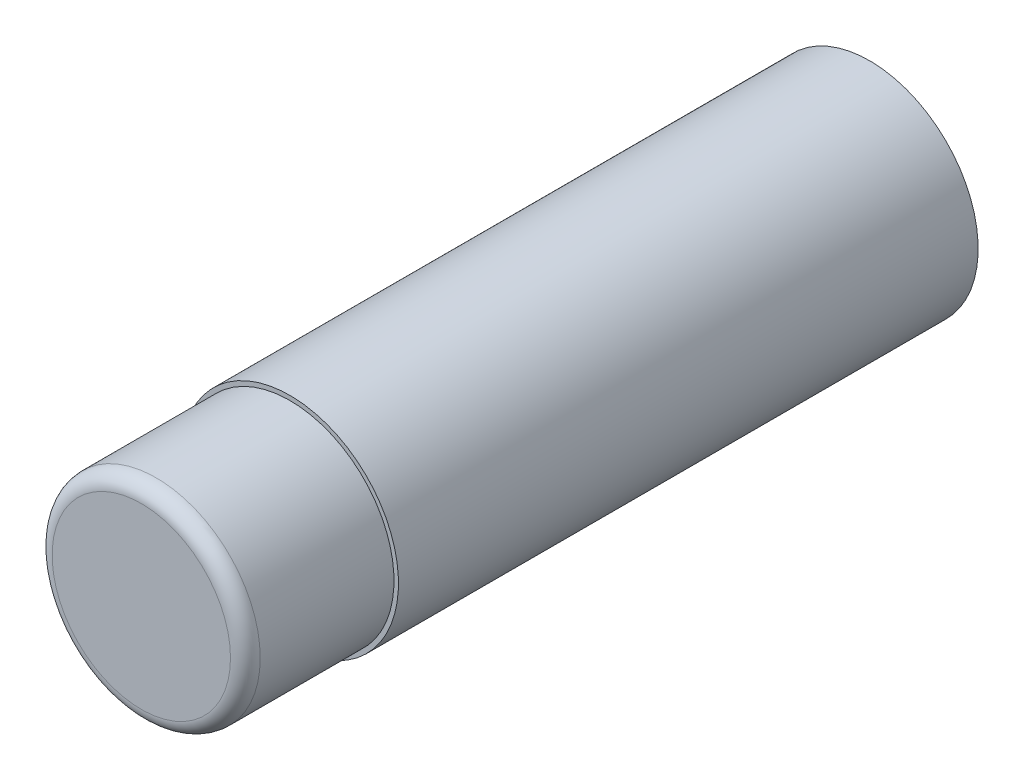
ISO-10303-21;
HEADER;
FILE_DESCRIPTION(('STEP AP214'),'2;1');
FILE_NAME('part.step','',(''),(''),'','','');
FILE_SCHEMA(('AUTOMOTIVE_DESIGN { 1 0 10303 214 1 1 1 1 }'));
ENDSEC;
DATA;
#1=APPLICATION_CONTEXT('core data for automotive mechanical design processes');
#2=APPLICATION_PROTOCOL_DEFINITION('international standard','automotive_design',2000,#1);
#3=PRODUCT_CONTEXT('',#1,'mechanical');
#4=PRODUCT('Part','Part','',(#3));
#5=PRODUCT_RELATED_PRODUCT_CATEGORY('part','',(#4));
#6=PRODUCT_DEFINITION_FORMATION('','',#4);
#7=PRODUCT_DEFINITION_CONTEXT('part definition',#1,'design');
#8=PRODUCT_DEFINITION('design','',#6,#7);
#9=PRODUCT_DEFINITION_SHAPE('','',#8);
#10=(LENGTH_UNIT() NAMED_UNIT(*) SI_UNIT(.MILLI.,.METRE.));
#11=(NAMED_UNIT(*) PLANE_ANGLE_UNIT() SI_UNIT($,.RADIAN.));
#12=(NAMED_UNIT(*) SI_UNIT($,.STERADIAN.) SOLID_ANGLE_UNIT());
#13=UNCERTAINTY_MEASURE_WITH_UNIT(LENGTH_MEASURE(1.E-05),#10,'distance_accuracy_value','');
#14=(GEOMETRIC_REPRESENTATION_CONTEXT(3) GLOBAL_UNCERTAINTY_ASSIGNED_CONTEXT((#13)) GLOBAL_UNIT_ASSIGNED_CONTEXT((#10,
#11,#12)) REPRESENTATION_CONTEXT('',''));
#15=CARTESIAN_POINT('',(0.,0.,0.));
#16=DIRECTION('',(0.,0.,1.));
#17=DIRECTION('',(1.,0.,0.));
#18=AXIS2_PLACEMENT_3D('',#15,#16,#17);
#19=CARTESIAN_POINT('',(0.,0.,24.5));
#20=DIRECTION('',(0.,0.,-1.));
#21=DIRECTION('',(-1.,0.,0.));
#22=AXIS2_PLACEMENT_3D('',#19,#20,#21);
#23=CYLINDRICAL_SURFACE('',#22,3.5);
#24=CARTESIAN_POINT('',(0.,0.,24.));
#25=DIRECTION('',(0.,0.,1.));
#26=DIRECTION('',(1.,0.,0.));
#27=AXIS2_PLACEMENT_3D('',#24,#25,#26);
#28=CIRCLE('',#27,3.5);
#29=CARTESIAN_POINT('',(3.5,0.,24.));
#30=VERTEX_POINT('',#29);
#31=EDGE_CURVE('E48',#30,#30,#28,.F.);
#32=ORIENTED_EDGE('',*,*,#31,.T.);
#33=EDGE_LOOP('',(#32));
#34=FACE_BOUND('',#33,.T.);
#35=CARTESIAN_POINT('',(0.,0.,19.5));
#36=DIRECTION('',(0.,0.,-1.));
#37=DIRECTION('',(-1.,0.,0.));
#38=AXIS2_PLACEMENT_3D('',#35,#36,#37);
#39=CIRCLE('',#38,3.5);
#40=CARTESIAN_POINT('',(-3.5,0.,19.5));
#41=VERTEX_POINT('',#40);
#42=EDGE_CURVE('E10',#41,#41,#39,.T.);
#43=ORIENTED_EDGE('',*,*,#42,.F.);
#44=EDGE_LOOP('',(#43));
#45=FACE_BOUND('',#44,.T.);
#46=ADVANCED_FACE('F40',(#34,#45),#23,.T.);
#47=CARTESIAN_POINT('',(0.,0.,24.5));
#48=DIRECTION('',(0.,0.,1.));
#49=DIRECTION('',(1.,0.,0.));
#50=AXIS2_PLACEMENT_3D('',#47,#48,#49);
#51=PLANE('',#50);
#52=CARTESIAN_POINT('',(0.,0.,24.5));
#53=DIRECTION('',(0.,0.,1.));
#54=DIRECTION('',(1.,0.,0.));
#55=AXIS2_PLACEMENT_3D('',#52,#53,#54);
#56=CIRCLE('',#55,3.);
#57=CARTESIAN_POINT('',(3.,0.,24.5));
#58=VERTEX_POINT('',#57);
#59=EDGE_CURVE('E53',#58,#58,#56,.T.);
#60=ORIENTED_EDGE('',*,*,#59,.T.);
#61=EDGE_LOOP('',(#60));
#62=FACE_BOUND('',#61,.T.);
#63=ADVANCED_FACE('F84',(#62),#51,.T.);
#64=CARTESIAN_POINT('',(0.,0.,24.));
#65=DIRECTION('',(0.,0.,1.));
#66=DIRECTION('',(1.,0.,0.));
#67=AXIS2_PLACEMENT_3D('',#64,#65,#66);
#68=TOROIDAL_SURFACE('',#67,3.,0.5);
#69=ORIENTED_EDGE('',*,*,#31,.F.);
#70=EDGE_LOOP('',(#69));
#71=FACE_BOUND('',#70,.T.);
#72=ORIENTED_EDGE('',*,*,#59,.F.);
#73=EDGE_LOOP('',(#72));
#74=FACE_BOUND('',#73,.T.);
#75=ADVANCED_FACE('F42',(#71,#74),#68,.T.);
#76=CARTESIAN_POINT('',(0.,0.,19.5));
#77=DIRECTION('',(0.,0.,-1.));
#78=DIRECTION('',(-1.,0.,0.));
#79=AXIS2_PLACEMENT_3D('',#76,#77,#78);
#80=CYLINDRICAL_SURFACE('',#79,3.65);
#81=CARTESIAN_POINT('',(0.,0.,19.5));
#82=DIRECTION('',(0.,0.,-1.));
#83=DIRECTION('',(-1.,0.,0.));
#84=AXIS2_PLACEMENT_3D('',#81,#82,#83);
#85=CIRCLE('',#84,3.65);
#86=CARTESIAN_POINT('',(-3.65,0.,19.5));
#87=VERTEX_POINT('',#86);
#88=EDGE_CURVE('E58',#87,#87,#85,.T.);
#89=ORIENTED_EDGE('',*,*,#88,.T.);
#90=EDGE_LOOP('',(#89));
#91=FACE_BOUND('',#90,.T.);
#92=CARTESIAN_POINT('',(0.,0.,0.));
#93=DIRECTION('',(0.,0.,-1.));
#94=DIRECTION('',(-1.,0.,0.));
#95=AXIS2_PLACEMENT_3D('',#92,#93,#94);
#96=CIRCLE('',#95,3.65);
#97=CARTESIAN_POINT('',(-3.65,0.,0.));
#98=VERTEX_POINT('',#97);
#99=EDGE_CURVE('E61',#98,#98,#96,.T.);
#100=ORIENTED_EDGE('',*,*,#99,.F.);
#101=EDGE_LOOP('',(#100));
#102=FACE_BOUND('',#101,.T.);
#103=ADVANCED_FACE('F69',(#91,#102),#80,.T.);
#104=CARTESIAN_POINT('',(0.,0.,19.5));
#105=DIRECTION('',(0.,0.,-1.));
#106=DIRECTION('',(-1.,0.,0.));
#107=AXIS2_PLACEMENT_3D('',#104,#105,#106);
#108=PLANE('',#107);
#109=ORIENTED_EDGE('',*,*,#42,.T.);
#110=EDGE_LOOP('',(#109));
#111=FACE_BOUND('',#110,.T.);
#112=ORIENTED_EDGE('',*,*,#88,.F.);
#113=EDGE_LOOP('',(#112));
#114=FACE_BOUND('',#113,.T.);
#115=ADVANCED_FACE('F72',(#111,#114),#108,.F.);
#116=CARTESIAN_POINT('',(0.,0.,0.));
#117=DIRECTION('',(0.,0.,1.));
#118=DIRECTION('',(1.,0.,0.));
#119=AXIS2_PLACEMENT_3D('',#116,#117,#118);
#120=PLANE('',#119);
#121=ORIENTED_EDGE('',*,*,#99,.T.);
#122=EDGE_LOOP('',(#121));
#123=FACE_BOUND('',#122,.T.);
#124=ADVANCED_FACE('F74',(#123),#120,.F.);
#125=CLOSED_SHELL('',(#46,#63,#75,#103,#115,#124));
#126=MANIFOLD_SOLID_BREP('B2',#125);
#127=ADVANCED_BREP_SHAPE_REPRESENTATION('',(#18,#126),#14);
#128=SHAPE_DEFINITION_REPRESENTATION(#9,#127);
ENDSEC;
END-ISO-10303-21;
